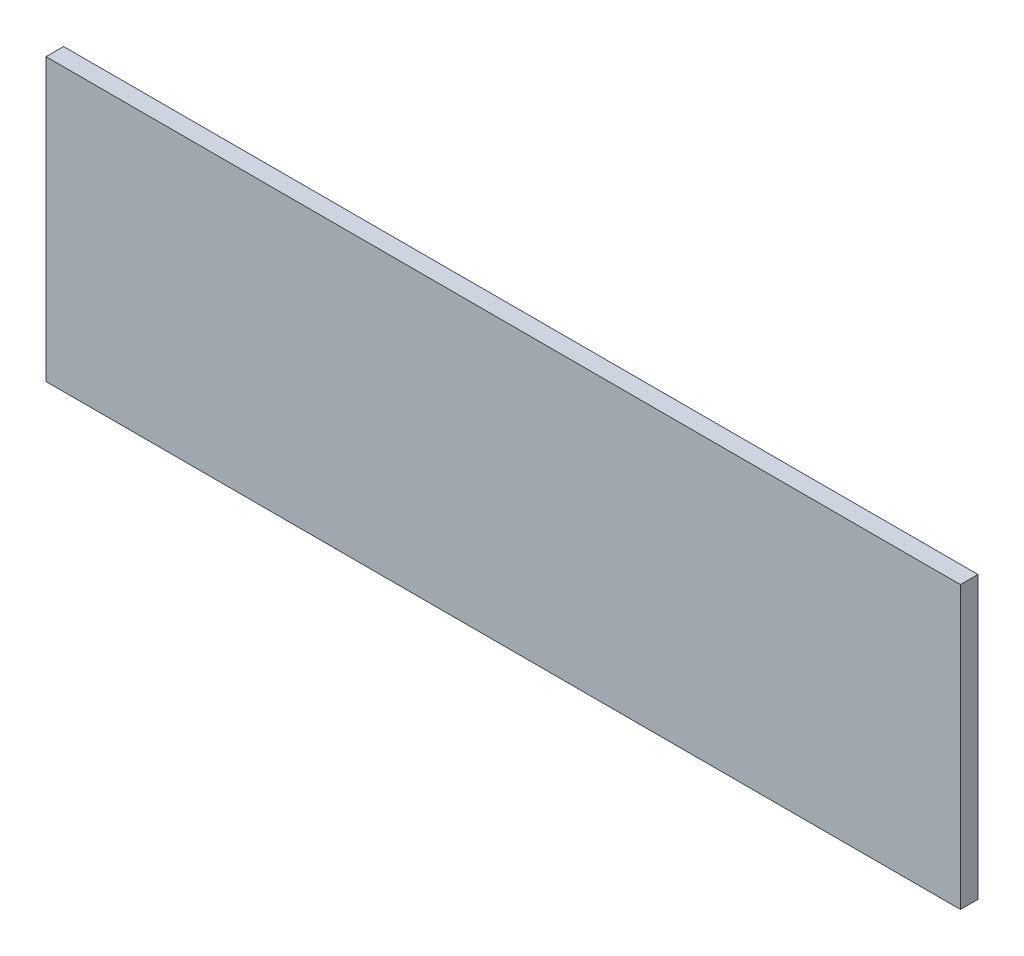
ISO-10303-21;
HEADER;
FILE_DESCRIPTION(('STEP AP214'),'2;1');
FILE_NAME('part.step','',(''),(''),'','','');
FILE_SCHEMA(('AUTOMOTIVE_DESIGN { 1 0 10303 214 1 1 1 1 }'));
ENDSEC;
DATA;
#1=APPLICATION_CONTEXT('core data for automotive mechanical design processes');
#2=APPLICATION_PROTOCOL_DEFINITION('international standard','automotive_design',2000,#1);
#3=PRODUCT_CONTEXT('',#1,'mechanical');
#4=PRODUCT('Part','Part','',(#3));
#5=PRODUCT_RELATED_PRODUCT_CATEGORY('part','',(#4));
#6=PRODUCT_DEFINITION_FORMATION('','',#4);
#7=PRODUCT_DEFINITION_CONTEXT('part definition',#1,'design');
#8=PRODUCT_DEFINITION('design','',#6,#7);
#9=PRODUCT_DEFINITION_SHAPE('','',#8);
#10=(LENGTH_UNIT() NAMED_UNIT(*) SI_UNIT(.MILLI.,.METRE.));
#11=(NAMED_UNIT(*) PLANE_ANGLE_UNIT() SI_UNIT($,.RADIAN.));
#12=(NAMED_UNIT(*) SI_UNIT($,.STERADIAN.) SOLID_ANGLE_UNIT());
#13=UNCERTAINTY_MEASURE_WITH_UNIT(LENGTH_MEASURE(1.E-05),#10,'distance_accuracy_value','');
#14=(GEOMETRIC_REPRESENTATION_CONTEXT(3) GLOBAL_UNCERTAINTY_ASSIGNED_CONTEXT((#13)) GLOBAL_UNIT_ASSIGNED_CONTEXT((#10,
#11,#12)) REPRESENTATION_CONTEXT('',''));
#15=CARTESIAN_POINT('',(0.,0.,0.));
#16=DIRECTION('',(0.,0.,1.));
#17=DIRECTION('',(1.,0.,0.));
#18=AXIS2_PLACEMENT_3D('',#15,#16,#17);
#19=CARTESIAN_POINT('',(0.,0.,1.58750000000001));
#20=DIRECTION('',(1.,0.,0.));
#21=DIRECTION('',(0.,1.,0.));
#22=AXIS2_PLACEMENT_3D('',#19,#20,#21);
#23=PLANE('',#22);
#24=DIRECTION('',(0.,-1.,0.));
#25=VECTOR('',#24,1.);
#26=CARTESIAN_POINT('',(0.,0.,0.));
#27=LINE('',#26,#25);
#28=CARTESIAN_POINT('',(0.,25.4,0.));
#29=VERTEX_POINT('',#28);
#30=CARTESIAN_POINT('',(0.,0.,0.));
#31=VERTEX_POINT('',#30);
#32=EDGE_CURVE('E97',#29,#31,#27,.T.);
#33=ORIENTED_EDGE('',*,*,#32,.T.);
#34=DIRECTION('',(0.,0.,-1.));
#35=VECTOR('',#34,1.);
#36=CARTESIAN_POINT('',(0.,0.,1.58750000000001));
#37=LINE('',#36,#35);
#38=CARTESIAN_POINT('',(0.,0.,1.58750000000001));
#39=VERTEX_POINT('',#38);
#40=EDGE_CURVE('E11',#39,#31,#37,.T.);
#41=ORIENTED_EDGE('',*,*,#40,.F.);
#42=DIRECTION('',(0.,-1.,0.));
#43=VECTOR('',#42,1.);
#44=CARTESIAN_POINT('',(0.,0.,1.58750000000001));
#45=LINE('',#44,#43);
#46=CARTESIAN_POINT('',(0.,25.4,1.58750000000001));
#47=VERTEX_POINT('',#46);
#48=EDGE_CURVE('E85',#47,#39,#45,.T.);
#49=ORIENTED_EDGE('',*,*,#48,.F.);
#50=DIRECTION('',(0.,0.,-1.));
#51=VECTOR('',#50,1.);
#52=CARTESIAN_POINT('',(0.,25.4,1.58750000000001));
#53=LINE('',#52,#51);
#54=EDGE_CURVE('E93',#47,#29,#53,.T.);
#55=ORIENTED_EDGE('',*,*,#54,.T.);
#56=EDGE_LOOP('',(#33,#41,#49,#55));
#57=FACE_BOUND('',#56,.T.);
#58=ADVANCED_FACE('F34',(#57),#23,.F.);
#59=CARTESIAN_POINT('',(0.,0.,1.58750000000001));
#60=DIRECTION('',(0.,1.,0.));
#61=DIRECTION('',(0.,0.,1.));
#62=AXIS2_PLACEMENT_3D('',#59,#60,#61);
#63=PLANE('',#62);
#64=DIRECTION('',(1.,0.,0.));
#65=VECTOR('',#64,1.);
#66=CARTESIAN_POINT('',(0.,0.,0.));
#67=LINE('',#66,#65);
#68=CARTESIAN_POINT('',(82.55,0.,0.));
#69=VERTEX_POINT('',#68);
#70=EDGE_CURVE('E89',#31,#69,#67,.T.);
#71=ORIENTED_EDGE('',*,*,#70,.T.);
#72=DIRECTION('',(0.,0.,-1.));
#73=VECTOR('',#72,1.);
#74=CARTESIAN_POINT('',(82.55,0.,1.58750000000001));
#75=LINE('',#74,#73);
#76=CARTESIAN_POINT('',(82.55,0.,1.58750000000001));
#77=VERTEX_POINT('',#76);
#78=EDGE_CURVE('E42',#77,#69,#75,.T.);
#79=ORIENTED_EDGE('',*,*,#78,.F.);
#80=DIRECTION('',(1.,0.,0.));
#81=VECTOR('',#80,1.);
#82=CARTESIAN_POINT('',(0.,0.,1.58750000000001));
#83=LINE('',#82,#81);
#84=EDGE_CURVE('E80',#39,#77,#83,.T.);
#85=ORIENTED_EDGE('',*,*,#84,.F.);
#86=ORIENTED_EDGE('',*,*,#40,.T.);
#87=EDGE_LOOP('',(#71,#79,#85,#86));
#88=FACE_BOUND('',#87,.T.);
#89=ADVANCED_FACE('F88',(#88),#63,.F.);
#90=CARTESIAN_POINT('',(82.55,0.,1.58750000000001));
#91=DIRECTION('',(-1.,0.,0.));
#92=DIRECTION('',(0.,-1.,0.));
#93=AXIS2_PLACEMENT_3D('',#90,#91,#92);
#94=PLANE('',#93);
#95=DIRECTION('',(0.,1.,0.));
#96=VECTOR('',#95,1.);
#97=CARTESIAN_POINT('',(82.55,0.,0.));
#98=LINE('',#97,#96);
#99=CARTESIAN_POINT('',(82.55,25.4,0.));
#100=VERTEX_POINT('',#99);
#101=EDGE_CURVE('E67',#69,#100,#98,.T.);
#102=ORIENTED_EDGE('',*,*,#101,.T.);
#103=DIRECTION('',(0.,0.,-1.));
#104=VECTOR('',#103,1.);
#105=CARTESIAN_POINT('',(82.55,25.4,1.58750000000001));
#106=LINE('',#105,#104);
#107=CARTESIAN_POINT('',(82.55,25.4,1.58750000000001));
#108=VERTEX_POINT('',#107);
#109=EDGE_CURVE('E90',#108,#100,#106,.T.);
#110=ORIENTED_EDGE('',*,*,#109,.F.);
#111=DIRECTION('',(0.,1.,0.));
#112=VECTOR('',#111,1.);
#113=CARTESIAN_POINT('',(82.55,0.,1.58750000000001));
#114=LINE('',#113,#112);
#115=EDGE_CURVE('E83',#77,#108,#114,.T.);
#116=ORIENTED_EDGE('',*,*,#115,.F.);
#117=ORIENTED_EDGE('',*,*,#78,.T.);
#118=EDGE_LOOP('',(#102,#110,#116,#117));
#119=FACE_BOUND('',#118,.T.);
#120=ADVANCED_FACE('F91',(#119),#94,.F.);
#121=CARTESIAN_POINT('',(0.,25.4,1.58750000000001));
#122=DIRECTION('',(0.,-1.,0.));
#123=DIRECTION('',(0.,0.,-1.));
#124=AXIS2_PLACEMENT_3D('',#121,#122,#123);
#125=PLANE('',#124);
#126=DIRECTION('',(-1.,0.,0.));
#127=VECTOR('',#126,1.);
#128=CARTESIAN_POINT('',(0.,25.4,0.));
#129=LINE('',#128,#127);
#130=EDGE_CURVE('E73',#100,#29,#129,.T.);
#131=ORIENTED_EDGE('',*,*,#130,.T.);
#132=ORIENTED_EDGE('',*,*,#54,.F.);
#133=DIRECTION('',(-1.,0.,0.));
#134=VECTOR('',#133,1.);
#135=CARTESIAN_POINT('',(0.,25.4,1.58750000000001));
#136=LINE('',#135,#134);
#137=EDGE_CURVE('E50',#108,#47,#136,.T.);
#138=ORIENTED_EDGE('',*,*,#137,.F.);
#139=ORIENTED_EDGE('',*,*,#109,.T.);
#140=EDGE_LOOP('',(#131,#132,#138,#139));
#141=FACE_BOUND('',#140,.T.);
#142=ADVANCED_FACE('F104',(#141),#125,.F.);
#143=CARTESIAN_POINT('',(0.,0.,1.58750000000001));
#144=DIRECTION('',(0.,0.,-1.));
#145=DIRECTION('',(-1.,0.,0.));
#146=AXIS2_PLACEMENT_3D('',#143,#144,#145);
#147=PLANE('',#146);
#148=ORIENTED_EDGE('',*,*,#48,.T.);
#149=ORIENTED_EDGE('',*,*,#84,.T.);
#150=ORIENTED_EDGE('',*,*,#115,.T.);
#151=ORIENTED_EDGE('',*,*,#137,.T.);
#152=EDGE_LOOP('',(#148,#149,#150,#151));
#153=FACE_BOUND('',#152,.T.);
#154=ADVANCED_FACE('F81',(#153),#147,.F.);
#155=CARTESIAN_POINT('',(0.,0.,0.));
#156=DIRECTION('',(0.,0.,-1.));
#157=DIRECTION('',(-1.,0.,0.));
#158=AXIS2_PLACEMENT_3D('',#155,#156,#157);
#159=PLANE('',#158);
#160=ORIENTED_EDGE('',*,*,#32,.F.);
#161=ORIENTED_EDGE('',*,*,#130,.F.);
#162=ORIENTED_EDGE('',*,*,#101,.F.);
#163=ORIENTED_EDGE('',*,*,#70,.F.);
#164=EDGE_LOOP('',(#160,#161,#162,#163));
#165=FACE_BOUND('',#164,.T.);
#166=ADVANCED_FACE('F107',(#165),#159,.T.);
#167=CLOSED_SHELL('',(#58,#89,#120,#142,#154,#166));
#168=MANIFOLD_SOLID_BREP('B2',#167);
#169=ADVANCED_BREP_SHAPE_REPRESENTATION('',(#18,#168),#14);
#170=SHAPE_DEFINITION_REPRESENTATION(#9,#169);
ENDSEC;
END-ISO-10303-21;
